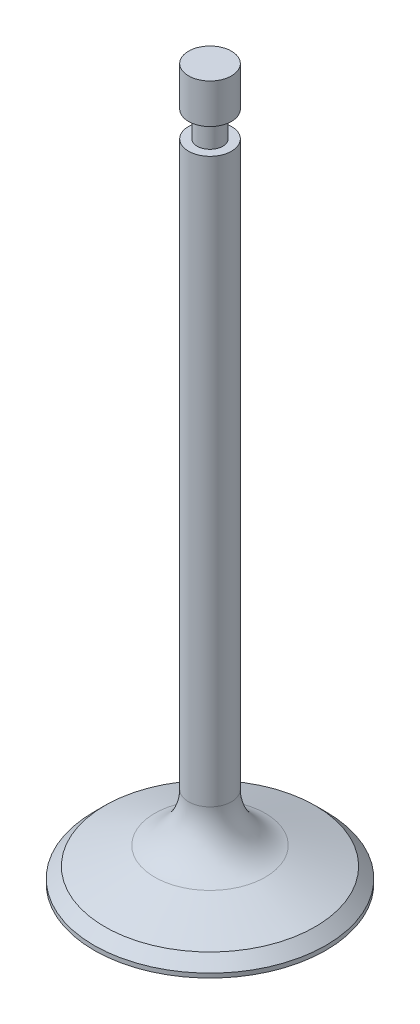
ISO-10303-21;
HEADER;
FILE_DESCRIPTION(('STEP AP214'),'2;1');
FILE_NAME('part.step','',(''),(''),'','','');
FILE_SCHEMA(('AUTOMOTIVE_DESIGN { 1 0 10303 214 1 1 1 1 }'));
ENDSEC;
DATA;
#1=APPLICATION_CONTEXT('core data for automotive mechanical design processes');
#2=APPLICATION_PROTOCOL_DEFINITION('international standard','automotive_design',2000,#1);
#3=PRODUCT_CONTEXT('',#1,'mechanical');
#4=PRODUCT('Part','Part','',(#3));
#5=PRODUCT_RELATED_PRODUCT_CATEGORY('part','',(#4));
#6=PRODUCT_DEFINITION_FORMATION('','',#4);
#7=PRODUCT_DEFINITION_CONTEXT('part definition',#1,'design');
#8=PRODUCT_DEFINITION('design','',#6,#7);
#9=PRODUCT_DEFINITION_SHAPE('','',#8);
#10=(LENGTH_UNIT() NAMED_UNIT(*) SI_UNIT(.MILLI.,.METRE.));
#11=(NAMED_UNIT(*) PLANE_ANGLE_UNIT() SI_UNIT($,.RADIAN.));
#12=(NAMED_UNIT(*) SI_UNIT($,.STERADIAN.) SOLID_ANGLE_UNIT());
#13=UNCERTAINTY_MEASURE_WITH_UNIT(LENGTH_MEASURE(1.E-05),#10,'distance_accuracy_value','');
#14=(GEOMETRIC_REPRESENTATION_CONTEXT(3) GLOBAL_UNCERTAINTY_ASSIGNED_CONTEXT((#13)) GLOBAL_UNIT_ASSIGNED_CONTEXT((#10,
#11,#12)) REPRESENTATION_CONTEXT('',''));
#15=CARTESIAN_POINT('',(0.,0.,0.));
#16=DIRECTION('',(0.,0.,1.));
#17=DIRECTION('',(1.,0.,0.));
#18=AXIS2_PLACEMENT_3D('',#15,#16,#17);
#19=CARTESIAN_POINT('',(0.,73.5249999999999,0.));
#20=DIRECTION('',(0.,-1.,0.));
#21=DIRECTION('',(1.,0.,0.));
#22=AXIS2_PLACEMENT_3D('',#19,#20,#21);
#23=SPHERICAL_SURFACE('',#22,73.5249999999999);
#24=CARTESIAN_POINT('',(0.,1.25,0.));
#25=DIRECTION('',(0.,-1.,0.));
#26=DIRECTION('',(0.,0.,-1.));
#27=AXIS2_PLACEMENT_3D('',#24,#25,#26);
#28=CIRCLE('',#27,13.5);
#29=CARTESIAN_POINT('',(0.,1.25,-13.5));
#30=VERTEX_POINT('',#29);
#31=EDGE_CURVE('E10',#30,#30,#28,.T.);
#32=ORIENTED_EDGE('',*,*,#31,.T.);
#33=EDGE_LOOP('',(#32));
#34=FACE_BOUND('',#33,.T.);
#35=ADVANCED_FACE('F37',(#34),#23,.T.);
#36=CARTESIAN_POINT('',(0.,0.,0.));
#37=DIRECTION('',(0.,-1.,0.));
#38=DIRECTION('',(0.,0.,-1.));
#39=AXIS2_PLACEMENT_3D('',#36,#37,#38);
#40=CYLINDRICAL_SURFACE('',#39,13.5);
#41=CARTESIAN_POINT('',(0.,1.75,0.));
#42=DIRECTION('',(0.,-1.,0.));
#43=DIRECTION('',(0.,0.,-1.));
#44=AXIS2_PLACEMENT_3D('',#41,#42,#43);
#45=CIRCLE('',#44,13.5);
#46=CARTESIAN_POINT('',(0.,1.75,-13.5));
#47=VERTEX_POINT('',#46);
#48=EDGE_CURVE('E44',#47,#47,#45,.T.);
#49=ORIENTED_EDGE('',*,*,#48,.T.);
#50=EDGE_LOOP('',(#49));
#51=FACE_BOUND('',#50,.T.);
#52=ORIENTED_EDGE('',*,*,#31,.F.);
#53=EDGE_LOOP('',(#52));
#54=FACE_BOUND('',#53,.T.);
#55=ADVANCED_FACE('F97',(#51,#54),#40,.T.);
#56=CARTESIAN_POINT('',(0.,1.75,0.));
#57=DIRECTION('',(0.,-1.,0.));
#58=DIRECTION('',(0.,0.,-1.));
#59=AXIS2_PLACEMENT_3D('',#56,#57,#58);
#60=CONICAL_SURFACE('',#59,13.5,0.785398163397449);
#61=CARTESIAN_POINT('',(0.,3.,0.));
#62=DIRECTION('',(0.,-1.,0.));
#63=DIRECTION('',(0.,0.,-1.));
#64=AXIS2_PLACEMENT_3D('',#61,#62,#63);
#65=CIRCLE('',#64,12.25);
#66=CARTESIAN_POINT('',(0.,3.,-12.25));
#67=VERTEX_POINT('',#66);
#68=EDGE_CURVE('E49',#67,#67,#65,.T.);
#69=ORIENTED_EDGE('',*,*,#68,.T.);
#70=EDGE_LOOP('',(#69));
#71=FACE_BOUND('',#70,.T.);
#72=ORIENTED_EDGE('',*,*,#48,.F.);
#73=EDGE_LOOP('',(#72));
#74=FACE_BOUND('',#73,.T.);
#75=ADVANCED_FACE('F101',(#71,#74),#60,.T.);
#76=CARTESIAN_POINT('',(0.,3.,0.));
#77=DIRECTION('',(0.,-1.,0.));
#78=DIRECTION('',(0.,0.,-1.));
#79=AXIS2_PLACEMENT_3D('',#76,#77,#78);
#80=CONICAL_SURFACE('',#79,12.25,1.22173047639604);
#81=CARTESIAN_POINT('',(0.,5.11179928863823,0.));
#82=DIRECTION('',(0.,-1.,0.));
#83=DIRECTION('',(0.,0.,-1.));
#84=AXIS2_PLACEMENT_3D('',#81,#82,#83);
#85=CIRCLE('',#84,6.44787914004603);
#86=CARTESIAN_POINT('',(0.,5.11179928863823,-6.44787914004603));
#87=VERTEX_POINT('',#86);
#88=EDGE_CURVE('E54',#87,#87,#85,.T.);
#89=ORIENTED_EDGE('',*,*,#88,.T.);
#90=EDGE_LOOP('',(#89));
#91=FACE_BOUND('',#90,.T.);
#92=ORIENTED_EDGE('',*,*,#68,.F.);
#93=EDGE_LOOP('',(#92));
#94=FACE_BOUND('',#93,.T.);
#95=ADVANCED_FACE('F105',(#91,#94),#80,.T.);
#96=CARTESIAN_POINT('',(0.,10.7499550133537,0.));
#97=DIRECTION('',(0.,-1.,0.));
#98=DIRECTION('',(0.,0.,-1.));
#99=AXIS2_PLACEMENT_3D('',#96,#97,#98);
#100=TOROIDAL_SURFACE('',#99,8.50000000000001,6.);
#101=CARTESIAN_POINT('',(0.,10.7499550133537,0.));
#102=DIRECTION('',(0.,-1.,0.));
#103=DIRECTION('',(0.,0.,-1.));
#104=AXIS2_PLACEMENT_3D('',#101,#102,#103);
#105=CIRCLE('',#104,2.50000000000001);
#106=CARTESIAN_POINT('',(0.,10.7499550133537,-2.50000000000001));
#107=VERTEX_POINT('',#106);
#108=EDGE_CURVE('E60',#107,#107,#105,.T.);
#109=ORIENTED_EDGE('',*,*,#108,.T.);
#110=EDGE_LOOP('',(#109));
#111=FACE_BOUND('',#110,.T.);
#112=ORIENTED_EDGE('',*,*,#88,.F.);
#113=EDGE_LOOP('',(#112));
#114=FACE_BOUND('',#113,.T.);
#115=ADVANCED_FACE('F112',(#111,#114),#100,.F.);
#116=CARTESIAN_POINT('',(0.,0.,0.));
#117=DIRECTION('',(0.,-1.,0.));
#118=DIRECTION('',(0.,0.,-1.));
#119=AXIS2_PLACEMENT_3D('',#116,#117,#118);
#120=CYLINDRICAL_SURFACE('',#119,2.5);
#121=CARTESIAN_POINT('',(0.,76.4,0.));
#122=DIRECTION('',(0.,-1.,0.));
#123=DIRECTION('',(0.,0.,-1.));
#124=AXIS2_PLACEMENT_3D('',#121,#122,#123);
#125=CIRCLE('',#124,2.5);
#126=CARTESIAN_POINT('',(0.,76.4,-2.5));
#127=VERTEX_POINT('',#126);
#128=EDGE_CURVE('E64',#127,#127,#125,.T.);
#129=ORIENTED_EDGE('',*,*,#128,.T.);
#130=EDGE_LOOP('',(#129));
#131=FACE_BOUND('',#130,.T.);
#132=ORIENTED_EDGE('',*,*,#108,.F.);
#133=EDGE_LOOP('',(#132));
#134=FACE_BOUND('',#133,.T.);
#135=ADVANCED_FACE('F116',(#131,#134),#120,.T.);
#136=CARTESIAN_POINT('',(1.5,76.4,0.));
#137=DIRECTION('',(0.,1.,0.));
#138=DIRECTION('',(0.,0.,1.));
#139=AXIS2_PLACEMENT_3D('',#136,#137,#138);
#140=PLANE('',#139);
#141=CARTESIAN_POINT('',(0.,76.4,0.));
#142=DIRECTION('',(0.,-1.,0.));
#143=DIRECTION('',(0.,0.,-1.));
#144=AXIS2_PLACEMENT_3D('',#141,#142,#143);
#145=CIRCLE('',#144,1.5);
#146=CARTESIAN_POINT('',(0.,76.4,-1.5));
#147=VERTEX_POINT('',#146);
#148=EDGE_CURVE('E68',#147,#147,#145,.T.);
#149=ORIENTED_EDGE('',*,*,#148,.T.);
#150=EDGE_LOOP('',(#149));
#151=FACE_BOUND('',#150,.T.);
#152=ORIENTED_EDGE('',*,*,#128,.F.);
#153=EDGE_LOOP('',(#152));
#154=FACE_BOUND('',#153,.T.);
#155=ADVANCED_FACE('F120',(#151,#154),#140,.T.);
#156=CARTESIAN_POINT('',(0.,0.,0.));
#157=DIRECTION('',(0.,-1.,0.));
#158=DIRECTION('',(0.,0.,-1.));
#159=AXIS2_PLACEMENT_3D('',#156,#157,#158);
#160=CYLINDRICAL_SURFACE('',#159,1.5);
#161=CARTESIAN_POINT('',(0.,79.4,0.));
#162=DIRECTION('',(0.,-1.,0.));
#163=DIRECTION('',(0.,0.,-1.));
#164=AXIS2_PLACEMENT_3D('',#161,#162,#163);
#165=CIRCLE('',#164,1.5);
#166=CARTESIAN_POINT('',(0.,79.4,-1.5));
#167=VERTEX_POINT('',#166);
#168=EDGE_CURVE('E72',#167,#167,#165,.T.);
#169=ORIENTED_EDGE('',*,*,#168,.T.);
#170=EDGE_LOOP('',(#169));
#171=FACE_BOUND('',#170,.T.);
#172=ORIENTED_EDGE('',*,*,#148,.F.);
#173=EDGE_LOOP('',(#172));
#174=FACE_BOUND('',#173,.T.);
#175=ADVANCED_FACE('F124',(#171,#174),#160,.T.);
#176=CARTESIAN_POINT('',(2.5,79.4,0.));
#177=DIRECTION('',(0.,-1.,0.));
#178=DIRECTION('',(0.,0.,-1.));
#179=AXIS2_PLACEMENT_3D('',#176,#177,#178);
#180=PLANE('',#179);
#181=CARTESIAN_POINT('',(0.,79.4,0.));
#182=DIRECTION('',(0.,-1.,0.));
#183=DIRECTION('',(0.,0.,-1.));
#184=AXIS2_PLACEMENT_3D('',#181,#182,#183);
#185=CIRCLE('',#184,2.5);
#186=CARTESIAN_POINT('',(0.,79.4,-2.5));
#187=VERTEX_POINT('',#186);
#188=EDGE_CURVE('E76',#187,#187,#185,.T.);
#189=ORIENTED_EDGE('',*,*,#188,.T.);
#190=EDGE_LOOP('',(#189));
#191=FACE_BOUND('',#190,.T.);
#192=ORIENTED_EDGE('',*,*,#168,.F.);
#193=EDGE_LOOP('',(#192));
#194=FACE_BOUND('',#193,.T.);
#195=ADVANCED_FACE('F94',(#191,#194),#180,.T.);
#196=CARTESIAN_POINT('',(0.,0.,0.));
#197=DIRECTION('',(0.,-1.,0.));
#198=DIRECTION('',(0.,0.,-1.));
#199=AXIS2_PLACEMENT_3D('',#196,#197,#198);
#200=CYLINDRICAL_SURFACE('',#199,2.5);
#201=CARTESIAN_POINT('',(0.,84.,0.));
#202=DIRECTION('',(0.,-1.,0.));
#203=DIRECTION('',(0.,0.,-1.));
#204=AXIS2_PLACEMENT_3D('',#201,#202,#203);
#205=CIRCLE('',#204,2.5);
#206=CARTESIAN_POINT('',(0.,84.,-2.5));
#207=VERTEX_POINT('',#206);
#208=EDGE_CURVE('E80',#207,#207,#205,.T.);
#209=ORIENTED_EDGE('',*,*,#208,.T.);
#210=EDGE_LOOP('',(#209));
#211=FACE_BOUND('',#210,.T.);
#212=ORIENTED_EDGE('',*,*,#188,.F.);
#213=EDGE_LOOP('',(#212));
#214=FACE_BOUND('',#213,.T.);
#215=ADVANCED_FACE('F85',(#211,#214),#200,.T.);
#216=CARTESIAN_POINT('',(0.,84.,0.));
#217=DIRECTION('',(0.,1.,0.));
#218=DIRECTION('',(0.,0.,1.));
#219=AXIS2_PLACEMENT_3D('',#216,#217,#218);
#220=PLANE('',#219);
#221=ORIENTED_EDGE('',*,*,#208,.F.);
#222=EDGE_LOOP('',(#221));
#223=FACE_BOUND('',#222,.T.);
#224=ADVANCED_FACE('F88',(#223),#220,.T.);
#225=CLOSED_SHELL('',(#35,#55,#75,#95,#115,#135,#155,#175,#195,#215,#224));
#226=MANIFOLD_SOLID_BREP('B2',#225);
#227=ADVANCED_BREP_SHAPE_REPRESENTATION('',(#18,#226),#14);
#228=SHAPE_DEFINITION_REPRESENTATION(#9,#227);
ENDSEC;
END-ISO-10303-21;
